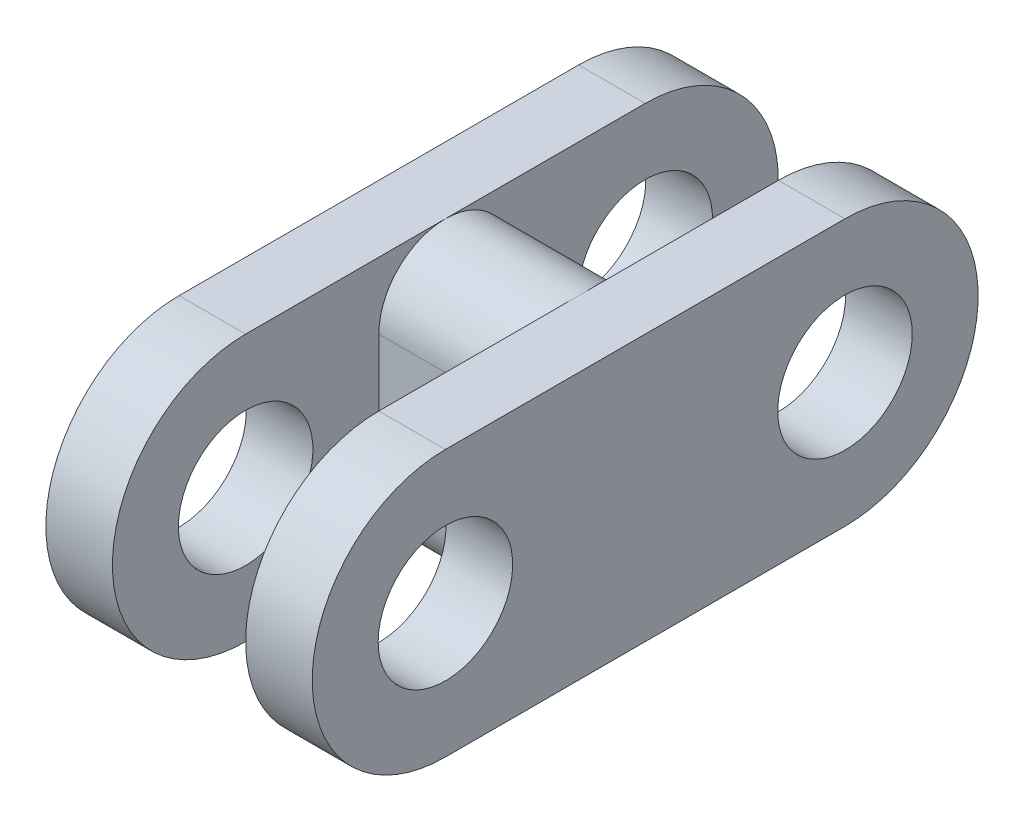
ISO-10303-21;
HEADER;
FILE_DESCRIPTION(('STEP AP214'),'2;1');
FILE_NAME('part.step','',(''),(''),'','','');
FILE_SCHEMA(('AUTOMOTIVE_DESIGN { 1 0 10303 214 1 1 1 1 }'));
ENDSEC;
DATA;
#1=APPLICATION_CONTEXT('core data for automotive mechanical design processes');
#2=APPLICATION_PROTOCOL_DEFINITION('international standard','automotive_design',2000,#1);
#3=PRODUCT_CONTEXT('',#1,'mechanical');
#4=PRODUCT('Part','Part','',(#3));
#5=PRODUCT_RELATED_PRODUCT_CATEGORY('part','',(#4));
#6=PRODUCT_DEFINITION_FORMATION('','',#4);
#7=PRODUCT_DEFINITION_CONTEXT('part definition',#1,'design');
#8=PRODUCT_DEFINITION('design','',#6,#7);
#9=PRODUCT_DEFINITION_SHAPE('','',#8);
#10=(LENGTH_UNIT() NAMED_UNIT(*) SI_UNIT(.MILLI.,.METRE.));
#11=(NAMED_UNIT(*) PLANE_ANGLE_UNIT() SI_UNIT($,.RADIAN.));
#12=(NAMED_UNIT(*) SI_UNIT($,.STERADIAN.) SOLID_ANGLE_UNIT());
#13=UNCERTAINTY_MEASURE_WITH_UNIT(LENGTH_MEASURE(1.E-05),#10,'distance_accuracy_value','');
#14=(GEOMETRIC_REPRESENTATION_CONTEXT(3) GLOBAL_UNCERTAINTY_ASSIGNED_CONTEXT((#13)) GLOBAL_UNIT_ASSIGNED_CONTEXT((#10,
#11,#12)) REPRESENTATION_CONTEXT('',''));
#15=CARTESIAN_POINT('',(0.,0.,0.));
#16=DIRECTION('',(0.,0.,1.));
#17=DIRECTION('',(1.,0.,0.));
#18=AXIS2_PLACEMENT_3D('',#15,#16,#17);
#19=CARTESIAN_POINT('',(2.5,-5.,20.));
#20=DIRECTION('',(-1.,0.,0.));
#21=DIRECTION('',(0.,0.,1.));
#22=AXIS2_PLACEMENT_3D('',#19,#20,#21);
#23=PLANE('',#22);
#24=CARTESIAN_POINT('',(2.5,-5.,20.));
#25=DIRECTION('',(-1.,0.,0.));
#26=DIRECTION('',(0.,0.,1.));
#27=AXIS2_PLACEMENT_3D('',#24,#25,#26);
#28=CIRCLE('',#27,2.52500000000001);
#29=CARTESIAN_POINT('',(2.5,-5.,22.525));
#30=VERTEX_POINT('',#29);
#31=EDGE_CURVE('E464',#30,#30,#28,.T.);
#32=ORIENTED_EDGE('',*,*,#31,.T.);
#33=EDGE_LOOP('',(#32));
#34=FACE_BOUND('',#33,.T.);
#35=DIRECTION('',(0.,-1.,0.));
#36=VECTOR('',#35,1.);
#37=CARTESIAN_POINT('',(2.5,-7.5,15.));
#38=LINE('',#37,#36);
#39=CARTESIAN_POINT('',(2.5,-2.5,15.));
#40=VERTEX_POINT('',#39);
#41=CARTESIAN_POINT('',(2.5,-7.5,15.));
#42=VERTEX_POINT('',#41);
#43=EDGE_CURVE('E194',#40,#42,#38,.T.);
#44=ORIENTED_EDGE('',*,*,#43,.F.);
#45=CARTESIAN_POINT('',(2.5,-2.5,12.5));
#46=DIRECTION('',(1.,0.,0.));
#47=DIRECTION('',(0.,0.,1.));
#48=AXIS2_PLACEMENT_3D('',#45,#46,#47);
#49=CIRCLE('',#48,2.5);
#50=CARTESIAN_POINT('',(2.5,0.,12.5));
#51=VERTEX_POINT('',#50);
#52=EDGE_CURVE('E11',#51,#40,#49,.T.);
#53=ORIENTED_EDGE('',*,*,#52,.F.);
#54=DIRECTION('',(0.,0.,-1.));
#55=VECTOR('',#54,1.);
#56=CARTESIAN_POINT('',(2.5,0.,20.));
#57=LINE('',#56,#55);
#58=CARTESIAN_POINT('',(2.5,0.,20.));
#59=VERTEX_POINT('',#58);
#60=EDGE_CURVE('E214',#59,#51,#57,.T.);
#61=ORIENTED_EDGE('',*,*,#60,.F.);
#62=CARTESIAN_POINT('',(2.5,-5.,20.));
#63=DIRECTION('',(-1.,0.,0.));
#64=DIRECTION('',(0.,0.,1.));
#65=AXIS2_PLACEMENT_3D('',#62,#63,#64);
#66=CIRCLE('',#65,5.);
#67=CARTESIAN_POINT('',(2.5,-10.,20.));
#68=VERTEX_POINT('',#67);
#69=EDGE_CURVE('E209',#68,#59,#66,.T.);
#70=ORIENTED_EDGE('',*,*,#69,.F.);
#71=DIRECTION('',(0.,0.,1.));
#72=VECTOR('',#71,1.);
#73=CARTESIAN_POINT('',(2.5,-10.,5.));
#74=LINE('',#73,#72);
#75=CARTESIAN_POINT('',(2.5,-10.,12.5));
#76=VERTEX_POINT('',#75);
#77=EDGE_CURVE('E220',#76,#68,#74,.T.);
#78=ORIENTED_EDGE('',*,*,#77,.F.);
#79=CARTESIAN_POINT('',(2.5,-7.5,12.5));
#80=DIRECTION('',(1.,0.,0.));
#81=DIRECTION('',(0.,0.,1.));
#82=AXIS2_PLACEMENT_3D('',#79,#80,#81);
#83=CIRCLE('',#82,2.5);
#84=EDGE_CURVE('E171',#42,#76,#83,.T.);
#85=ORIENTED_EDGE('',*,*,#84,.F.);
#86=EDGE_LOOP('',(#44,#53,#61,#70,#78,#85));
#87=FACE_BOUND('',#86,.T.);
#88=ADVANCED_FACE('F39',(#34,#87),#23,.F.);
#89=CARTESIAN_POINT('',(2.5,-5.,5.));
#90=DIRECTION('',(-1.,0.,0.));
#91=DIRECTION('',(0.,0.,1.));
#92=AXIS2_PLACEMENT_3D('',#89,#90,#91);
#93=CIRCLE('',#92,2.52500000000001);
#94=CARTESIAN_POINT('',(2.5,-5.,7.52500000000001));
#95=VERTEX_POINT('',#94);
#96=EDGE_CURVE('E456',#95,#95,#93,.T.);
#97=ORIENTED_EDGE('',*,*,#96,.T.);
#98=EDGE_LOOP('',(#97));
#99=FACE_BOUND('',#98,.T.);
#100=CARTESIAN_POINT('',(2.5,-7.5,10.));
#101=VERTEX_POINT('',#100);
#102=EDGE_CURVE('E48',#76,#101,#83,.T.);
#103=ORIENTED_EDGE('',*,*,#102,.F.);
#104=CARTESIAN_POINT('',(2.5,-10.,5.));
#105=VERTEX_POINT('',#104);
#106=EDGE_CURVE('E221',#105,#76,#74,.T.);
#107=ORIENTED_EDGE('',*,*,#106,.F.);
#108=CARTESIAN_POINT('',(2.5,-5.,5.));
#109=DIRECTION('',(-1.,0.,0.));
#110=DIRECTION('',(0.,0.,1.));
#111=AXIS2_PLACEMENT_3D('',#108,#109,#110);
#112=CIRCLE('',#111,5.);
#113=CARTESIAN_POINT('',(2.5,0.,5.));
#114=VERTEX_POINT('',#113);
#115=EDGE_CURVE('E217',#114,#105,#112,.T.);
#116=ORIENTED_EDGE('',*,*,#115,.F.);
#117=EDGE_CURVE('E212',#51,#114,#57,.T.);
#118=ORIENTED_EDGE('',*,*,#117,.F.);
#119=CARTESIAN_POINT('',(2.5,-2.5,10.));
#120=VERTEX_POINT('',#119);
#121=EDGE_CURVE('E50',#120,#51,#49,.T.);
#122=ORIENTED_EDGE('',*,*,#121,.F.);
#123=DIRECTION('',(0.,1.,0.));
#124=VECTOR('',#123,1.);
#125=CARTESIAN_POINT('',(2.5,-2.5,10.));
#126=LINE('',#125,#124);
#127=EDGE_CURVE('E174',#101,#120,#126,.T.);
#128=ORIENTED_EDGE('',*,*,#127,.F.);
#129=EDGE_LOOP('',(#103,#107,#116,#118,#122,#128));
#130=FACE_BOUND('',#129,.T.);
#131=ADVANCED_FACE('F258',(#99,#130),#23,.F.);
#132=CARTESIAN_POINT('',(2.5,-5.,20.));
#133=DIRECTION('',(-1.,0.,0.));
#134=DIRECTION('',(0.,0.,1.));
#135=AXIS2_PLACEMENT_3D('',#132,#133,#134);
#136=CYLINDRICAL_SURFACE('',#135,5.);
#137=CARTESIAN_POINT('',(0.,-5.,20.));
#138=DIRECTION('',(-1.,0.,0.));
#139=DIRECTION('',(0.,0.,1.));
#140=AXIS2_PLACEMENT_3D('',#137,#138,#139);
#141=CIRCLE('',#140,5.);
#142=CARTESIAN_POINT('',(0.,-10.,20.));
#143=VERTEX_POINT('',#142);
#144=CARTESIAN_POINT('',(0.,0.,20.));
#145=VERTEX_POINT('',#144);
#146=EDGE_CURVE('E208',#143,#145,#141,.T.);
#147=ORIENTED_EDGE('',*,*,#146,.F.);
#148=DIRECTION('',(-1.,0.,0.));
#149=VECTOR('',#148,1.);
#150=CARTESIAN_POINT('',(2.5,-10.,20.));
#151=LINE('',#150,#149);
#152=EDGE_CURVE('E234',#68,#143,#151,.T.);
#153=ORIENTED_EDGE('',*,*,#152,.F.);
#154=ORIENTED_EDGE('',*,*,#69,.T.);
#155=DIRECTION('',(-1.,0.,0.));
#156=VECTOR('',#155,1.);
#157=CARTESIAN_POINT('',(2.5,0.,20.));
#158=LINE('',#157,#156);
#159=EDGE_CURVE('E43',#59,#145,#158,.T.);
#160=ORIENTED_EDGE('',*,*,#159,.T.);
#161=EDGE_LOOP('',(#147,#153,#154,#160));
#162=FACE_BOUND('',#161,.T.);
#163=ADVANCED_FACE('F41',(#162),#136,.T.);
#164=CARTESIAN_POINT('',(2.5,-10.,5.));
#165=DIRECTION('',(0.,-1.,0.));
#166=DIRECTION('',(0.,0.,-1.));
#167=AXIS2_PLACEMENT_3D('',#164,#165,#166);
#168=PLANE('',#167);
#169=DIRECTION('',(0.,0.,1.));
#170=VECTOR('',#169,1.);
#171=CARTESIAN_POINT('',(0.,-10.,5.));
#172=LINE('',#171,#170);
#173=CARTESIAN_POINT('',(0.,-10.,5.));
#174=VERTEX_POINT('',#173);
#175=EDGE_CURVE('E213',#174,#143,#172,.T.);
#176=ORIENTED_EDGE('',*,*,#175,.F.);
#177=DIRECTION('',(-1.,0.,0.));
#178=VECTOR('',#177,1.);
#179=CARTESIAN_POINT('',(2.5,-10.,5.));
#180=LINE('',#179,#178);
#181=EDGE_CURVE('E236',#105,#174,#180,.T.);
#182=ORIENTED_EDGE('',*,*,#181,.F.);
#183=ORIENTED_EDGE('',*,*,#106,.T.);
#184=ORIENTED_EDGE('',*,*,#77,.T.);
#185=ORIENTED_EDGE('',*,*,#152,.T.);
#186=EDGE_LOOP('',(#176,#182,#183,#184,#185));
#187=FACE_BOUND('',#186,.T.);
#188=ADVANCED_FACE('F252',(#187),#168,.T.);
#189=CARTESIAN_POINT('',(2.5,-5.,5.));
#190=DIRECTION('',(-1.,0.,0.));
#191=DIRECTION('',(0.,0.,1.));
#192=AXIS2_PLACEMENT_3D('',#189,#190,#191);
#193=CYLINDRICAL_SURFACE('',#192,5.);
#194=CARTESIAN_POINT('',(0.,-5.,5.));
#195=DIRECTION('',(-1.,0.,0.));
#196=DIRECTION('',(0.,0.,1.));
#197=AXIS2_PLACEMENT_3D('',#194,#195,#196);
#198=CIRCLE('',#197,5.);
#199=CARTESIAN_POINT('',(0.,0.,5.));
#200=VERTEX_POINT('',#199);
#201=EDGE_CURVE('E229',#200,#174,#198,.T.);
#202=ORIENTED_EDGE('',*,*,#201,.F.);
#203=DIRECTION('',(-1.,0.,0.));
#204=VECTOR('',#203,1.);
#205=CARTESIAN_POINT('',(2.5,0.,5.));
#206=LINE('',#205,#204);
#207=EDGE_CURVE('E237',#114,#200,#206,.T.);
#208=ORIENTED_EDGE('',*,*,#207,.F.);
#209=ORIENTED_EDGE('',*,*,#115,.T.);
#210=ORIENTED_EDGE('',*,*,#181,.T.);
#211=EDGE_LOOP('',(#202,#208,#209,#210));
#212=FACE_BOUND('',#211,.T.);
#213=ADVANCED_FACE('F325',(#212),#193,.T.);
#214=CARTESIAN_POINT('',(2.5,0.,20.));
#215=DIRECTION('',(0.,1.,0.));
#216=DIRECTION('',(0.,0.,1.));
#217=AXIS2_PLACEMENT_3D('',#214,#215,#216);
#218=PLANE('',#217);
#219=DIRECTION('',(0.,0.,-1.));
#220=VECTOR('',#219,1.);
#221=CARTESIAN_POINT('',(0.,0.,20.));
#222=LINE('',#221,#220);
#223=EDGE_CURVE('E226',#145,#200,#222,.T.);
#224=ORIENTED_EDGE('',*,*,#223,.F.);
#225=ORIENTED_EDGE('',*,*,#159,.F.);
#226=ORIENTED_EDGE('',*,*,#60,.T.);
#227=ORIENTED_EDGE('',*,*,#117,.T.);
#228=ORIENTED_EDGE('',*,*,#207,.T.);
#229=EDGE_LOOP('',(#224,#225,#226,#227,#228));
#230=FACE_BOUND('',#229,.T.);
#231=ADVANCED_FACE('F247',(#230),#218,.T.);
#232=CARTESIAN_POINT('',(0.,-5.,20.));
#233=DIRECTION('',(-1.,0.,0.));
#234=DIRECTION('',(0.,0.,1.));
#235=AXIS2_PLACEMENT_3D('',#232,#233,#234);
#236=PLANE('',#235);
#237=CARTESIAN_POINT('',(0.,-5.,20.));
#238=DIRECTION('',(-1.,0.,0.));
#239=DIRECTION('',(0.,0.,1.));
#240=AXIS2_PLACEMENT_3D('',#237,#238,#239);
#241=CIRCLE('',#240,2.52500000000001);
#242=CARTESIAN_POINT('',(0.,-5.,22.525));
#243=VERTEX_POINT('',#242);
#244=EDGE_CURVE('E466',#243,#243,#241,.T.);
#245=ORIENTED_EDGE('',*,*,#244,.F.);
#246=EDGE_LOOP('',(#245));
#247=FACE_BOUND('',#246,.T.);
#248=CARTESIAN_POINT('',(0.,-5.,5.));
#249=DIRECTION('',(-1.,0.,0.));
#250=DIRECTION('',(0.,0.,1.));
#251=AXIS2_PLACEMENT_3D('',#248,#249,#250);
#252=CIRCLE('',#251,2.52500000000001);
#253=CARTESIAN_POINT('',(0.,-5.,7.52500000000001));
#254=VERTEX_POINT('',#253);
#255=EDGE_CURVE('E461',#254,#254,#252,.T.);
#256=ORIENTED_EDGE('',*,*,#255,.F.);
#257=EDGE_LOOP('',(#256));
#258=FACE_BOUND('',#257,.T.);
#259=ORIENTED_EDGE('',*,*,#146,.T.);
#260=ORIENTED_EDGE('',*,*,#223,.T.);
#261=ORIENTED_EDGE('',*,*,#201,.T.);
#262=ORIENTED_EDGE('',*,*,#175,.T.);
#263=EDGE_LOOP('',(#259,#260,#261,#262));
#264=FACE_BOUND('',#263,.T.);
#265=ADVANCED_FACE('F249',(#247,#258,#264),#236,.T.);
#266=CARTESIAN_POINT('',(7.5,-7.5,12.5));
#267=DIRECTION('',(-1.,0.,0.));
#268=DIRECTION('',(0.,0.,1.));
#269=AXIS2_PLACEMENT_3D('',#266,#267,#268);
#270=CYLINDRICAL_SURFACE('',#269,2.5);
#271=ORIENTED_EDGE('',*,*,#84,.T.);
#272=ORIENTED_EDGE('',*,*,#102,.T.);
#273=DIRECTION('',(-1.,0.,0.));
#274=VECTOR('',#273,1.);
#275=CARTESIAN_POINT('',(7.5,-7.5,10.));
#276=LINE('',#275,#274);
#277=CARTESIAN_POINT('',(7.5,-7.5,10.));
#278=VERTEX_POINT('',#277);
#279=EDGE_CURVE('E205',#278,#101,#276,.T.);
#280=ORIENTED_EDGE('',*,*,#279,.F.);
#281=CARTESIAN_POINT('',(7.5,-7.5,12.5));
#282=DIRECTION('',(1.,0.,0.));
#283=DIRECTION('',(0.,0.,1.));
#284=AXIS2_PLACEMENT_3D('',#281,#282,#283);
#285=CIRCLE('',#284,2.5);
#286=CARTESIAN_POINT('',(7.5,-10.,12.5));
#287=VERTEX_POINT('',#286);
#288=EDGE_CURVE('E65',#287,#278,#285,.T.);
#289=ORIENTED_EDGE('',*,*,#288,.F.);
#290=CARTESIAN_POINT('',(7.5,-7.5,15.));
#291=VERTEX_POINT('',#290);
#292=EDGE_CURVE('E180',#291,#287,#285,.T.);
#293=ORIENTED_EDGE('',*,*,#292,.F.);
#294=DIRECTION('',(-1.,0.,0.));
#295=VECTOR('',#294,1.);
#296=CARTESIAN_POINT('',(7.5,-7.5,15.));
#297=LINE('',#296,#295);
#298=EDGE_CURVE('E189',#291,#42,#297,.T.);
#299=ORIENTED_EDGE('',*,*,#298,.T.);
#300=EDGE_LOOP('',(#271,#272,#280,#289,#293,#299));
#301=FACE_BOUND('',#300,.T.);
#302=ADVANCED_FACE('F263',(#301),#270,.T.);
#303=CARTESIAN_POINT('',(7.5,-2.5,10.));
#304=DIRECTION('',(0.,0.,1.));
#305=DIRECTION('',(1.,0.,0.));
#306=AXIS2_PLACEMENT_3D('',#303,#304,#305);
#307=PLANE('',#306);
#308=ORIENTED_EDGE('',*,*,#127,.T.);
#309=DIRECTION('',(-1.,0.,0.));
#310=VECTOR('',#309,1.);
#311=CARTESIAN_POINT('',(7.5,-2.5,10.));
#312=LINE('',#311,#310);
#313=CARTESIAN_POINT('',(7.5,-2.5,10.));
#314=VERTEX_POINT('',#313);
#315=EDGE_CURVE('E202',#314,#120,#312,.T.);
#316=ORIENTED_EDGE('',*,*,#315,.F.);
#317=DIRECTION('',(0.,1.,0.));
#318=VECTOR('',#317,1.);
#319=CARTESIAN_POINT('',(7.5,-2.5,10.));
#320=LINE('',#319,#318);
#321=EDGE_CURVE('E182',#278,#314,#320,.T.);
#322=ORIENTED_EDGE('',*,*,#321,.F.);
#323=ORIENTED_EDGE('',*,*,#279,.T.);
#324=EDGE_LOOP('',(#308,#316,#322,#323));
#325=FACE_BOUND('',#324,.T.);
#326=ADVANCED_FACE('F262',(#325),#307,.F.);
#327=CARTESIAN_POINT('',(7.5,-2.5,12.5));
#328=DIRECTION('',(-1.,0.,0.));
#329=DIRECTION('',(0.,0.,1.));
#330=AXIS2_PLACEMENT_3D('',#327,#328,#329);
#331=CYLINDRICAL_SURFACE('',#330,2.5);
#332=ORIENTED_EDGE('',*,*,#121,.T.);
#333=ORIENTED_EDGE('',*,*,#52,.T.);
#334=DIRECTION('',(-1.,0.,0.));
#335=VECTOR('',#334,1.);
#336=CARTESIAN_POINT('',(7.5,-2.5,15.));
#337=LINE('',#336,#335);
#338=CARTESIAN_POINT('',(7.5,-2.5,15.));
#339=VERTEX_POINT('',#338);
#340=EDGE_CURVE('E199',#339,#40,#337,.T.);
#341=ORIENTED_EDGE('',*,*,#340,.F.);
#342=CARTESIAN_POINT('',(7.5,-2.5,12.5));
#343=DIRECTION('',(1.,0.,0.));
#344=DIRECTION('',(0.,0.,1.));
#345=AXIS2_PLACEMENT_3D('',#342,#343,#344);
#346=CIRCLE('',#345,2.5);
#347=CARTESIAN_POINT('',(7.5,0.,12.5));
#348=VERTEX_POINT('',#347);
#349=EDGE_CURVE('E57',#348,#339,#346,.T.);
#350=ORIENTED_EDGE('',*,*,#349,.F.);
#351=EDGE_CURVE('E185',#314,#348,#346,.T.);
#352=ORIENTED_EDGE('',*,*,#351,.F.);
#353=ORIENTED_EDGE('',*,*,#315,.T.);
#354=EDGE_LOOP('',(#332,#333,#341,#350,#352,#353));
#355=FACE_BOUND('',#354,.T.);
#356=ADVANCED_FACE('F256',(#355),#331,.T.);
#357=CARTESIAN_POINT('',(7.5,-7.5,15.));
#358=DIRECTION('',(0.,0.,-1.));
#359=DIRECTION('',(-1.,0.,0.));
#360=AXIS2_PLACEMENT_3D('',#357,#358,#359);
#361=PLANE('',#360);
#362=ORIENTED_EDGE('',*,*,#43,.T.);
#363=ORIENTED_EDGE('',*,*,#298,.F.);
#364=DIRECTION('',(0.,-1.,0.));
#365=VECTOR('',#364,1.);
#366=CARTESIAN_POINT('',(7.5,-7.5,15.));
#367=LINE('',#366,#365);
#368=EDGE_CURVE('E187',#339,#291,#367,.T.);
#369=ORIENTED_EDGE('',*,*,#368,.F.);
#370=ORIENTED_EDGE('',*,*,#340,.T.);
#371=EDGE_LOOP('',(#362,#363,#369,#370));
#372=FACE_BOUND('',#371,.T.);
#373=ADVANCED_FACE('F356',(#372),#361,.F.);
#374=CARTESIAN_POINT('',(7.5,-5.,20.));
#375=DIRECTION('',(-1.,0.,0.));
#376=DIRECTION('',(0.,0.,1.));
#377=AXIS2_PLACEMENT_3D('',#374,#375,#376);
#378=PLANE('',#377);
#379=CARTESIAN_POINT('',(7.5,-5.,20.));
#380=DIRECTION('',(-1.,0.,0.));
#381=DIRECTION('',(0.,0.,1.));
#382=AXIS2_PLACEMENT_3D('',#379,#380,#381);
#383=CIRCLE('',#382,2.52500000000001);
#384=CARTESIAN_POINT('',(7.5,-5.,22.525));
#385=VERTEX_POINT('',#384);
#386=EDGE_CURVE('E454',#385,#385,#383,.T.);
#387=ORIENTED_EDGE('',*,*,#386,.F.);
#388=EDGE_LOOP('',(#387));
#389=FACE_BOUND('',#388,.T.);
#390=ORIENTED_EDGE('',*,*,#368,.T.);
#391=ORIENTED_EDGE('',*,*,#292,.T.);
#392=DIRECTION('',(0.,0.,-1.));
#393=VECTOR('',#392,1.);
#394=CARTESIAN_POINT('',(7.5,-10.,5.));
#395=LINE('',#394,#393);
#396=CARTESIAN_POINT('',(7.5,-10.,20.));
#397=VERTEX_POINT('',#396);
#398=EDGE_CURVE('E271',#397,#287,#395,.T.);
#399=ORIENTED_EDGE('',*,*,#398,.F.);
#400=CARTESIAN_POINT('',(7.5,-5.,20.));
#401=DIRECTION('',(1.,0.,0.));
#402=DIRECTION('',(0.,0.,1.));
#403=AXIS2_PLACEMENT_3D('',#400,#401,#402);
#404=CIRCLE('',#403,5.);
#405=CARTESIAN_POINT('',(7.5,0.,20.));
#406=VERTEX_POINT('',#405);
#407=EDGE_CURVE('E170',#406,#397,#404,.T.);
#408=ORIENTED_EDGE('',*,*,#407,.F.);
#409=DIRECTION('',(0.,0.,1.));
#410=VECTOR('',#409,1.);
#411=CARTESIAN_POINT('',(7.5,0.,20.));
#412=LINE('',#411,#410);
#413=EDGE_CURVE('E274',#348,#406,#412,.T.);
#414=ORIENTED_EDGE('',*,*,#413,.F.);
#415=ORIENTED_EDGE('',*,*,#349,.T.);
#416=EDGE_LOOP('',(#390,#391,#399,#408,#414,#415));
#417=FACE_BOUND('',#416,.T.);
#418=ADVANCED_FACE('F288',(#389,#417),#378,.T.);
#419=CARTESIAN_POINT('',(10.,-5.,20.));
#420=DIRECTION('',(-1.,0.,0.));
#421=DIRECTION('',(0.,0.,1.));
#422=AXIS2_PLACEMENT_3D('',#419,#420,#421);
#423=CYLINDRICAL_SURFACE('',#422,5.);
#424=ORIENTED_EDGE('',*,*,#407,.T.);
#425=DIRECTION('',(-1.,0.,0.));
#426=VECTOR('',#425,1.);
#427=CARTESIAN_POINT('',(10.,-10.,20.));
#428=LINE('',#427,#426);
#429=CARTESIAN_POINT('',(10.,-10.,20.));
#430=VERTEX_POINT('',#429);
#431=EDGE_CURVE('E150',#430,#397,#428,.T.);
#432=ORIENTED_EDGE('',*,*,#431,.F.);
#433=CARTESIAN_POINT('',(10.,-5.,20.));
#434=DIRECTION('',(1.,0.,0.));
#435=DIRECTION('',(0.,0.,1.));
#436=AXIS2_PLACEMENT_3D('',#433,#434,#435);
#437=CIRCLE('',#436,5.);
#438=CARTESIAN_POINT('',(10.,0.,20.));
#439=VERTEX_POINT('',#438);
#440=EDGE_CURVE('E157',#439,#430,#437,.T.);
#441=ORIENTED_EDGE('',*,*,#440,.F.);
#442=DIRECTION('',(-1.,0.,0.));
#443=VECTOR('',#442,1.);
#444=CARTESIAN_POINT('',(10.,0.,20.));
#445=LINE('',#444,#443);
#446=EDGE_CURVE('E281',#439,#406,#445,.T.);
#447=ORIENTED_EDGE('',*,*,#446,.T.);
#448=EDGE_LOOP('',(#424,#432,#441,#447));
#449=FACE_BOUND('',#448,.T.);
#450=ADVANCED_FACE('F168',(#449),#423,.T.);
#451=CARTESIAN_POINT('',(10.,-10.,5.));
#452=DIRECTION('',(0.,1.,0.));
#453=DIRECTION('',(0.,0.,1.));
#454=AXIS2_PLACEMENT_3D('',#451,#452,#453);
#455=PLANE('',#454);
#456=ORIENTED_EDGE('',*,*,#398,.T.);
#457=CARTESIAN_POINT('',(7.5,-10.,5.));
#458=VERTEX_POINT('',#457);
#459=EDGE_CURVE('E268',#287,#458,#395,.T.);
#460=ORIENTED_EDGE('',*,*,#459,.T.);
#461=DIRECTION('',(-1.,0.,0.));
#462=VECTOR('',#461,1.);
#463=CARTESIAN_POINT('',(10.,-10.,5.));
#464=LINE('',#463,#462);
#465=CARTESIAN_POINT('',(10.,-10.,5.));
#466=VERTEX_POINT('',#465);
#467=EDGE_CURVE('E153',#466,#458,#464,.T.);
#468=ORIENTED_EDGE('',*,*,#467,.F.);
#469=DIRECTION('',(0.,0.,-1.));
#470=VECTOR('',#469,1.);
#471=CARTESIAN_POINT('',(10.,-10.,5.));
#472=LINE('',#471,#470);
#473=EDGE_CURVE('E145',#430,#466,#472,.T.);
#474=ORIENTED_EDGE('',*,*,#473,.F.);
#475=ORIENTED_EDGE('',*,*,#431,.T.);
#476=EDGE_LOOP('',(#456,#460,#468,#474,#475));
#477=FACE_BOUND('',#476,.T.);
#478=ADVANCED_FACE('F148',(#477),#455,.F.);
#479=CARTESIAN_POINT('',(10.,-5.,5.));
#480=DIRECTION('',(-1.,0.,0.));
#481=DIRECTION('',(0.,0.,1.));
#482=AXIS2_PLACEMENT_3D('',#479,#480,#481);
#483=CYLINDRICAL_SURFACE('',#482,5.);
#484=CARTESIAN_POINT('',(7.5,-5.,5.));
#485=DIRECTION('',(1.,0.,0.));
#486=DIRECTION('',(0.,0.,1.));
#487=AXIS2_PLACEMENT_3D('',#484,#485,#486);
#488=CIRCLE('',#487,5.);
#489=CARTESIAN_POINT('',(7.5,0.,5.));
#490=VERTEX_POINT('',#489);
#491=EDGE_CURVE('E270',#458,#490,#488,.T.);
#492=ORIENTED_EDGE('',*,*,#491,.T.);
#493=DIRECTION('',(-1.,0.,0.));
#494=VECTOR('',#493,1.);
#495=CARTESIAN_POINT('',(10.,0.,5.));
#496=LINE('',#495,#494);
#497=CARTESIAN_POINT('',(10.,0.,5.));
#498=VERTEX_POINT('',#497);
#499=EDGE_CURVE('E176',#498,#490,#496,.T.);
#500=ORIENTED_EDGE('',*,*,#499,.F.);
#501=CARTESIAN_POINT('',(10.,-5.,5.));
#502=DIRECTION('',(1.,0.,0.));
#503=DIRECTION('',(0.,0.,1.));
#504=AXIS2_PLACEMENT_3D('',#501,#502,#503);
#505=CIRCLE('',#504,5.);
#506=EDGE_CURVE('E156',#466,#498,#505,.T.);
#507=ORIENTED_EDGE('',*,*,#506,.F.);
#508=ORIENTED_EDGE('',*,*,#467,.T.);
#509=EDGE_LOOP('',(#492,#500,#507,#508));
#510=FACE_BOUND('',#509,.T.);
#511=ADVANCED_FACE('F300',(#510),#483,.T.);
#512=CARTESIAN_POINT('',(10.,0.,20.));
#513=DIRECTION('',(0.,-1.,0.));
#514=DIRECTION('',(0.,0.,-1.));
#515=AXIS2_PLACEMENT_3D('',#512,#513,#514);
#516=PLANE('',#515);
#517=EDGE_CURVE('E166',#490,#348,#412,.T.);
#518=ORIENTED_EDGE('',*,*,#517,.T.);
#519=ORIENTED_EDGE('',*,*,#413,.T.);
#520=ORIENTED_EDGE('',*,*,#446,.F.);
#521=DIRECTION('',(0.,0.,1.));
#522=VECTOR('',#521,1.);
#523=CARTESIAN_POINT('',(10.,0.,20.));
#524=LINE('',#523,#522);
#525=EDGE_CURVE('E162',#498,#439,#524,.T.);
#526=ORIENTED_EDGE('',*,*,#525,.F.);
#527=ORIENTED_EDGE('',*,*,#499,.T.);
#528=EDGE_LOOP('',(#518,#519,#520,#526,#527));
#529=FACE_BOUND('',#528,.T.);
#530=ADVANCED_FACE('F285',(#529),#516,.F.);
#531=CARTESIAN_POINT('',(10.,-5.,20.));
#532=DIRECTION('',(-1.,0.,0.));
#533=DIRECTION('',(0.,0.,1.));
#534=AXIS2_PLACEMENT_3D('',#531,#532,#533);
#535=PLANE('',#534);
#536=CARTESIAN_POINT('',(10.,-5.,20.));
#537=DIRECTION('',(-1.,0.,0.));
#538=DIRECTION('',(0.,0.,1.));
#539=AXIS2_PLACEMENT_3D('',#536,#537,#538);
#540=CIRCLE('',#539,2.52500000000001);
#541=CARTESIAN_POINT('',(10.,-5.,22.525));
#542=VERTEX_POINT('',#541);
#543=EDGE_CURVE('E296',#542,#542,#540,.T.);
#544=ORIENTED_EDGE('',*,*,#543,.T.);
#545=EDGE_LOOP('',(#544));
#546=FACE_BOUND('',#545,.T.);
#547=CARTESIAN_POINT('',(10.,-5.,5.));
#548=DIRECTION('',(1.,0.,0.));
#549=DIRECTION('',(0.,0.,-1.));
#550=AXIS2_PLACEMENT_3D('',#547,#548,#549);
#551=CIRCLE('',#550,2.52500000000001);
#552=CARTESIAN_POINT('',(10.,-5.,2.47499999999999));
#553=VERTEX_POINT('',#552);
#554=EDGE_CURVE('E291',#553,#553,#551,.T.);
#555=ORIENTED_EDGE('',*,*,#554,.F.);
#556=EDGE_LOOP('',(#555));
#557=FACE_BOUND('',#556,.T.);
#558=ORIENTED_EDGE('',*,*,#440,.T.);
#559=ORIENTED_EDGE('',*,*,#473,.T.);
#560=ORIENTED_EDGE('',*,*,#506,.T.);
#561=ORIENTED_EDGE('',*,*,#525,.T.);
#562=EDGE_LOOP('',(#558,#559,#560,#561));
#563=FACE_BOUND('',#562,.T.);
#564=ADVANCED_FACE('F160',(#546,#557,#563),#535,.F.);
#565=CARTESIAN_POINT('',(7.5,-5.,5.));
#566=DIRECTION('',(-1.,0.,0.));
#567=DIRECTION('',(0.,0.,1.));
#568=AXIS2_PLACEMENT_3D('',#565,#566,#567);
#569=CIRCLE('',#568,2.52500000000001);
#570=CARTESIAN_POINT('',(7.5,-5.,7.52500000000001));
#571=VERTEX_POINT('',#570);
#572=EDGE_CURVE('E289',#571,#571,#569,.T.);
#573=ORIENTED_EDGE('',*,*,#572,.F.);
#574=EDGE_LOOP('',(#573));
#575=FACE_BOUND('',#574,.T.);
#576=ORIENTED_EDGE('',*,*,#459,.F.);
#577=ORIENTED_EDGE('',*,*,#288,.T.);
#578=ORIENTED_EDGE('',*,*,#321,.T.);
#579=ORIENTED_EDGE('',*,*,#351,.T.);
#580=ORIENTED_EDGE('',*,*,#517,.F.);
#581=ORIENTED_EDGE('',*,*,#491,.F.);
#582=EDGE_LOOP('',(#576,#577,#578,#579,#580,#581));
#583=FACE_BOUND('',#582,.T.);
#584=ADVANCED_FACE('F266',(#575,#583),#378,.T.);
#585=CARTESIAN_POINT('',(10.,-5.,5.));
#586=DIRECTION('',(1.,0.,0.));
#587=DIRECTION('',(0.,0.,-1.));
#588=AXIS2_PLACEMENT_3D('',#585,#586,#587);
#589=CYLINDRICAL_SURFACE('',#588,2.52500000000001);
#590=ORIENTED_EDGE('',*,*,#554,.T.);
#591=EDGE_LOOP('',(#590));
#592=FACE_BOUND('',#591,.T.);
#593=ORIENTED_EDGE('',*,*,#572,.T.);
#594=EDGE_LOOP('',(#593));
#595=FACE_BOUND('',#594,.T.);
#596=ADVANCED_FACE('F403',(#592,#595),#589,.F.);
#597=CARTESIAN_POINT('',(7.5,-5.,20.));
#598=DIRECTION('',(-1.,0.,0.));
#599=DIRECTION('',(0.,0.,1.));
#600=AXIS2_PLACEMENT_3D('',#597,#598,#599);
#601=CYLINDRICAL_SURFACE('',#600,2.52500000000001);
#602=ORIENTED_EDGE('',*,*,#543,.F.);
#603=EDGE_LOOP('',(#602));
#604=FACE_BOUND('',#603,.T.);
#605=ORIENTED_EDGE('',*,*,#386,.T.);
#606=EDGE_LOOP('',(#605));
#607=FACE_BOUND('',#606,.T.);
#608=ADVANCED_FACE('F411',(#604,#607),#601,.F.);
#609=CARTESIAN_POINT('',(0.,-5.,5.));
#610=DIRECTION('',(-1.,0.,0.));
#611=DIRECTION('',(0.,0.,1.));
#612=AXIS2_PLACEMENT_3D('',#609,#610,#611);
#613=CYLINDRICAL_SURFACE('',#612,2.52500000000001);
#614=ORIENTED_EDGE('',*,*,#255,.T.);
#615=EDGE_LOOP('',(#614));
#616=FACE_BOUND('',#615,.T.);
#617=ORIENTED_EDGE('',*,*,#96,.F.);
#618=EDGE_LOOP('',(#617));
#619=FACE_BOUND('',#618,.T.);
#620=ADVANCED_FACE('F422',(#616,#619),#613,.F.);
#621=CARTESIAN_POINT('',(0.,-5.,20.));
#622=DIRECTION('',(-1.,0.,0.));
#623=DIRECTION('',(0.,0.,1.));
#624=AXIS2_PLACEMENT_3D('',#621,#622,#623);
#625=CYLINDRICAL_SURFACE('',#624,2.52500000000001);
#626=ORIENTED_EDGE('',*,*,#244,.T.);
#627=EDGE_LOOP('',(#626));
#628=FACE_BOUND('',#627,.T.);
#629=ORIENTED_EDGE('',*,*,#31,.F.);
#630=EDGE_LOOP('',(#629));
#631=FACE_BOUND('',#630,.T.);
#632=ADVANCED_FACE('F428',(#628,#631),#625,.F.);
#633=CLOSED_SHELL('',(#88,#131,#163,#188,#213,#231,#265,#302,#326,#356,#373,#418,#450,#478,#511,
#530,#564,#584,#596,#608,#620,#632));
#634=MANIFOLD_SOLID_BREP('B2',#633);
#635=ADVANCED_BREP_SHAPE_REPRESENTATION('',(#18,#634),#14);
#636=SHAPE_DEFINITION_REPRESENTATION(#9,#635);
ENDSEC;
END-ISO-10303-21;
